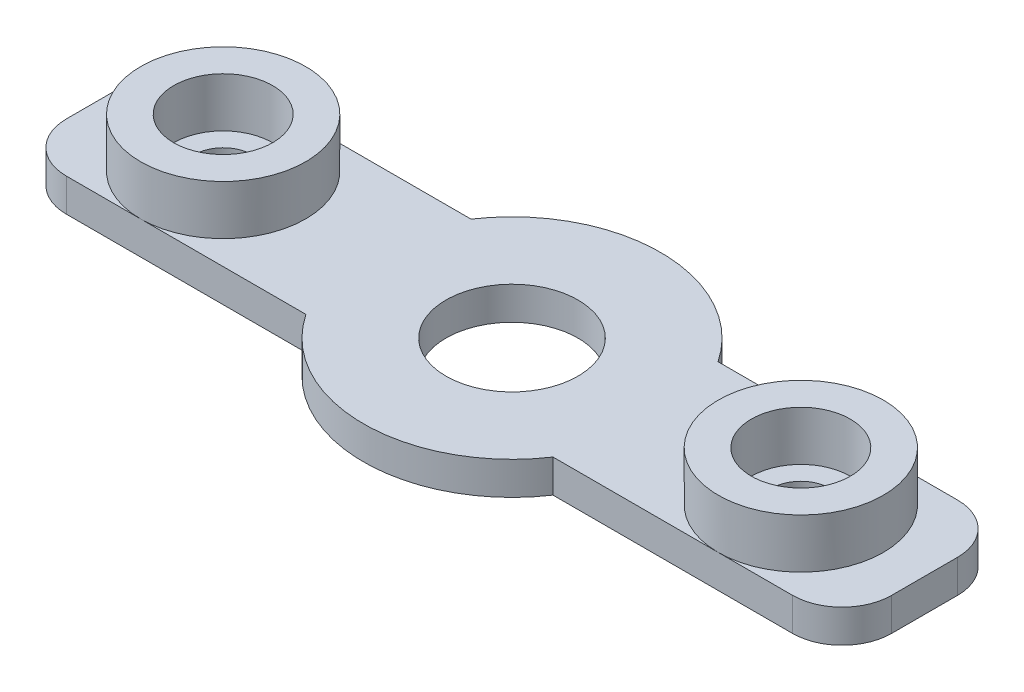
ISO-10303-21;
HEADER;
FILE_DESCRIPTION(('STEP AP214'),'2;1');
FILE_NAME('part.step','',(''),(''),'','','');
FILE_SCHEMA(('AUTOMOTIVE_DESIGN { 1 0 10303 214 1 1 1 1 }'));
ENDSEC;
DATA;
#1=APPLICATION_CONTEXT('core data for automotive mechanical design processes');
#2=APPLICATION_PROTOCOL_DEFINITION('international standard','automotive_design',2000,#1);
#3=PRODUCT_CONTEXT('',#1,'mechanical');
#4=PRODUCT('Part','Part','',(#3));
#5=PRODUCT_RELATED_PRODUCT_CATEGORY('part','',(#4));
#6=PRODUCT_DEFINITION_FORMATION('','',#4);
#7=PRODUCT_DEFINITION_CONTEXT('part definition',#1,'design');
#8=PRODUCT_DEFINITION('design','',#6,#7);
#9=PRODUCT_DEFINITION_SHAPE('','',#8);
#10=(LENGTH_UNIT() NAMED_UNIT(*) SI_UNIT(.MILLI.,.METRE.));
#11=(NAMED_UNIT(*) PLANE_ANGLE_UNIT() SI_UNIT($,.RADIAN.));
#12=(NAMED_UNIT(*) SI_UNIT($,.STERADIAN.) SOLID_ANGLE_UNIT());
#13=UNCERTAINTY_MEASURE_WITH_UNIT(LENGTH_MEASURE(1.E-05),#10,'distance_accuracy_value','');
#14=(GEOMETRIC_REPRESENTATION_CONTEXT(3) GLOBAL_UNCERTAINTY_ASSIGNED_CONTEXT((#13)) GLOBAL_UNIT_ASSIGNED_CONTEXT((#10,
#11,#12)) REPRESENTATION_CONTEXT('',''));
#15=CARTESIAN_POINT('',(0.,0.,0.));
#16=DIRECTION('',(0.,0.,1.));
#17=DIRECTION('',(1.,0.,0.));
#18=AXIS2_PLACEMENT_3D('',#15,#16,#17);
#19=CARTESIAN_POINT('',(0.,2.,0.));
#20=DIRECTION('',(0.,1.,0.));
#21=DIRECTION('',(0.,0.,1.));
#22=AXIS2_PLACEMENT_3D('',#19,#20,#21);
#23=PLANE('',#22);
#24=CARTESIAN_POINT('',(0.,2.,0.));
#25=DIRECTION('',(0.,1.,0.));
#26=DIRECTION('',(0.,0.,1.));
#27=AXIS2_PLACEMENT_3D('',#24,#25,#26);
#28=CIRCLE('',#27,4.);
#29=CARTESIAN_POINT('',(0.,2.,4.));
#30=VERTEX_POINT('',#29);
#31=EDGE_CURVE('E177',#30,#30,#28,.T.);
#32=ORIENTED_EDGE('',*,*,#31,.F.);
#33=EDGE_LOOP('',(#32));
#34=FACE_BOUND('',#33,.T.);
#35=DIRECTION('',(1.,0.,0.));
#36=VECTOR('',#35,1.);
#37=CARTESIAN_POINT('',(0.,2.,5.));
#38=LINE('',#37,#36);
#39=CARTESIAN_POINT('',(7.48331477354788,2.,5.));
#40=VERTEX_POINT('',#39);
#41=CARTESIAN_POINT('',(17.5,2.,5.));
#42=VERTEX_POINT('',#41);
#43=EDGE_CURVE('E145',#40,#42,#38,.T.);
#44=ORIENTED_EDGE('',*,*,#43,.T.);
#45=CARTESIAN_POINT('',(17.5,2.,0.));
#46=DIRECTION('',(0.,1.,0.));
#47=DIRECTION('',(0.,0.,-1.));
#48=AXIS2_PLACEMENT_3D('',#45,#46,#47);
#49=CIRCLE('',#48,5.);
#50=CARTESIAN_POINT('',(17.5,2.,-5.));
#51=VERTEX_POINT('',#50);
#52=EDGE_CURVE('E47',#51,#42,#49,.T.);
#53=ORIENTED_EDGE('',*,*,#52,.F.);
#54=DIRECTION('',(1.,0.,0.));
#55=VECTOR('',#54,1.);
#56=CARTESIAN_POINT('',(0.,2.,-5.));
#57=LINE('',#56,#55);
#58=CARTESIAN_POINT('',(7.48331477354788,2.,-5.));
#59=VERTEX_POINT('',#58);
#60=EDGE_CURVE('E143',#59,#51,#57,.T.);
#61=ORIENTED_EDGE('',*,*,#60,.F.);
#62=CARTESIAN_POINT('',(0.,2.,0.));
#63=DIRECTION('',(0.,1.,0.));
#64=DIRECTION('',(0.,0.,1.));
#65=AXIS2_PLACEMENT_3D('',#62,#63,#64);
#66=CIRCLE('',#65,9.);
#67=CARTESIAN_POINT('',(-7.48331477354788,2.,-5.));
#68=VERTEX_POINT('',#67);
#69=EDGE_CURVE('E162',#59,#68,#66,.T.);
#70=ORIENTED_EDGE('',*,*,#69,.T.);
#71=DIRECTION('',(1.,0.,0.));
#72=VECTOR('',#71,1.);
#73=CARTESIAN_POINT('',(0.,2.,-5.));
#74=LINE('',#73,#72);
#75=CARTESIAN_POINT('',(-17.5,2.,-5.));
#76=VERTEX_POINT('',#75);
#77=EDGE_CURVE('E163',#76,#68,#74,.T.);
#78=ORIENTED_EDGE('',*,*,#77,.F.);
#79=CARTESIAN_POINT('',(-17.5,2.,0.));
#80=DIRECTION('',(0.,1.,0.));
#81=DIRECTION('',(0.,0.,1.));
#82=AXIS2_PLACEMENT_3D('',#79,#80,#81);
#83=CIRCLE('',#82,5.);
#84=CARTESIAN_POINT('',(-17.5,2.,5.));
#85=VERTEX_POINT('',#84);
#86=EDGE_CURVE('E263',#85,#76,#83,.T.);
#87=ORIENTED_EDGE('',*,*,#86,.F.);
#88=DIRECTION('',(1.,0.,0.));
#89=VECTOR('',#88,1.);
#90=CARTESIAN_POINT('',(0.,2.,5.));
#91=LINE('',#90,#89);
#92=CARTESIAN_POINT('',(-7.48331477354788,2.,5.));
#93=VERTEX_POINT('',#92);
#94=EDGE_CURVE('E215',#85,#93,#91,.T.);
#95=ORIENTED_EDGE('',*,*,#94,.T.);
#96=CARTESIAN_POINT('',(0.,2.,0.));
#97=DIRECTION('',(0.,1.,0.));
#98=DIRECTION('',(0.,0.,1.));
#99=AXIS2_PLACEMENT_3D('',#96,#97,#98);
#100=CIRCLE('',#99,9.);
#101=EDGE_CURVE('E404',#93,#40,#100,.T.);
#102=ORIENTED_EDGE('',*,*,#101,.T.);
#103=EDGE_LOOP('',(#44,#53,#61,#70,#78,#87,#95,#102));
#104=FACE_BOUND('',#103,.T.);
#105=ADVANCED_FACE('F33',(#34,#104),#23,.T.);
#106=CARTESIAN_POINT('',(22.,2.,-5.));
#107=VERTEX_POINT('',#106);
#108=EDGE_CURVE('E148',#51,#107,#57,.T.);
#109=ORIENTED_EDGE('',*,*,#108,.F.);
#110=EDGE_CURVE('E131',#42,#51,#49,.T.);
#111=ORIENTED_EDGE('',*,*,#110,.F.);
#112=CARTESIAN_POINT('',(22.,2.,5.));
#113=VERTEX_POINT('',#112);
#114=EDGE_CURVE('E401',#42,#113,#38,.T.);
#115=ORIENTED_EDGE('',*,*,#114,.T.);
#116=CARTESIAN_POINT('',(22.,2.,2.));
#117=DIRECTION('',(0.,1.,0.));
#118=DIRECTION('',(0.,0.,1.));
#119=AXIS2_PLACEMENT_3D('',#116,#117,#118);
#120=CIRCLE('',#119,3.);
#121=CARTESIAN_POINT('',(25.,2.,2.));
#122=VERTEX_POINT('',#121);
#123=EDGE_CURVE('E242',#113,#122,#120,.T.);
#124=ORIENTED_EDGE('',*,*,#123,.T.);
#125=DIRECTION('',(0.,0.,1.));
#126=VECTOR('',#125,1.);
#127=CARTESIAN_POINT('',(25.,2.,0.));
#128=LINE('',#127,#126);
#129=CARTESIAN_POINT('',(25.,2.,-2.));
#130=VERTEX_POINT('',#129);
#131=EDGE_CURVE('E156',#130,#122,#128,.T.);
#132=ORIENTED_EDGE('',*,*,#131,.F.);
#133=CARTESIAN_POINT('',(22.,2.,-2.));
#134=DIRECTION('',(0.,1.,0.));
#135=DIRECTION('',(0.,0.,1.));
#136=AXIS2_PLACEMENT_3D('',#133,#134,#135);
#137=CIRCLE('',#136,3.);
#138=EDGE_CURVE('E152',#130,#107,#137,.T.);
#139=ORIENTED_EDGE('',*,*,#138,.T.);
#140=EDGE_LOOP('',(#109,#111,#115,#124,#132,#139));
#141=FACE_BOUND('',#140,.T.);
#142=ADVANCED_FACE('F149',(#141),#23,.T.);
#143=CARTESIAN_POINT('',(17.5,2.,0.));
#144=DIRECTION('',(0.,1.,0.));
#145=DIRECTION('',(0.,0.,1.));
#146=AXIS2_PLACEMENT_3D('',#143,#144,#145);
#147=CIRCLE('',#146,3.);
#148=CARTESIAN_POINT('',(17.5,2.,3.00000000000001));
#149=VERTEX_POINT('',#148);
#150=EDGE_CURVE('E11',#149,#149,#147,.F.);
#151=ORIENTED_EDGE('',*,*,#150,.F.);
#152=EDGE_LOOP('',(#151));
#153=FACE_BOUND('',#152,.T.);
#154=CARTESIAN_POINT('',(17.5,2.,0.));
#155=DIRECTION('',(0.,1.,0.));
#156=DIRECTION('',(0.,0.,1.));
#157=AXIS2_PLACEMENT_3D('',#154,#155,#156);
#158=CIRCLE('',#157,1.75);
#159=CARTESIAN_POINT('',(17.5,2.,1.75));
#160=VERTEX_POINT('',#159);
#161=EDGE_CURVE('E180',#160,#160,#158,.F.);
#162=ORIENTED_EDGE('',*,*,#161,.T.);
#163=EDGE_LOOP('',(#162));
#164=FACE_BOUND('',#163,.T.);
#165=ADVANCED_FACE('F308',(#153,#164),#23,.T.);
#166=CARTESIAN_POINT('',(-17.5,2.,0.));
#167=DIRECTION('',(0.,1.,0.));
#168=DIRECTION('',(0.,0.,1.));
#169=AXIS2_PLACEMENT_3D('',#166,#167,#168);
#170=CIRCLE('',#169,1.75);
#171=CARTESIAN_POINT('',(-17.5,2.,1.75));
#172=VERTEX_POINT('',#171);
#173=EDGE_CURVE('E174',#172,#172,#170,.T.);
#174=ORIENTED_EDGE('',*,*,#173,.F.);
#175=EDGE_LOOP('',(#174));
#176=FACE_BOUND('',#175,.T.);
#177=CARTESIAN_POINT('',(-17.5,2.,0.));
#178=DIRECTION('',(0.,1.,0.));
#179=DIRECTION('',(0.,0.,1.));
#180=AXIS2_PLACEMENT_3D('',#177,#178,#179);
#181=CIRCLE('',#180,3.);
#182=CARTESIAN_POINT('',(-17.5,2.,3.));
#183=VERTEX_POINT('',#182);
#184=EDGE_CURVE('E272',#183,#183,#181,.T.);
#185=ORIENTED_EDGE('',*,*,#184,.T.);
#186=EDGE_LOOP('',(#185));
#187=FACE_BOUND('',#186,.T.);
#188=ADVANCED_FACE('F315',(#176,#187),#23,.T.);
#189=CARTESIAN_POINT('',(0.,2.,5.));
#190=DIRECTION('',(0.,0.,-1.));
#191=DIRECTION('',(-1.,0.,0.));
#192=AXIS2_PLACEMENT_3D('',#189,#190,#191);
#193=PLANE('',#192);
#194=CARTESIAN_POINT('',(-22.,2.,5.));
#195=VERTEX_POINT('',#194);
#196=EDGE_CURVE('E406',#195,#85,#91,.T.);
#197=ORIENTED_EDGE('',*,*,#196,.F.);
#198=DIRECTION('',(0.,-1.,0.));
#199=VECTOR('',#198,1.);
#200=CARTESIAN_POINT('',(-22.,2.,5.));
#201=LINE('',#200,#199);
#202=CARTESIAN_POINT('',(-22.,0.,5.));
#203=VERTEX_POINT('',#202);
#204=EDGE_CURVE('E256',#195,#203,#201,.T.);
#205=ORIENTED_EDGE('',*,*,#204,.T.);
#206=DIRECTION('',(1.,0.,0.));
#207=VECTOR('',#206,1.);
#208=CARTESIAN_POINT('',(0.,0.,5.));
#209=LINE('',#208,#207);
#210=CARTESIAN_POINT('',(-7.48331477354788,0.,5.));
#211=VERTEX_POINT('',#210);
#212=EDGE_CURVE('E184',#203,#211,#209,.T.);
#213=ORIENTED_EDGE('',*,*,#212,.T.);
#214=DIRECTION('',(0.,-1.,0.));
#215=VECTOR('',#214,1.);
#216=CARTESIAN_POINT('',(-7.48331477354788,2.,5.));
#217=LINE('',#216,#215);
#218=EDGE_CURVE('E222',#93,#211,#217,.T.);
#219=ORIENTED_EDGE('',*,*,#218,.F.);
#220=ORIENTED_EDGE('',*,*,#94,.F.);
#221=EDGE_LOOP('',(#197,#205,#213,#219,#220));
#222=FACE_BOUND('',#221,.T.);
#223=ADVANCED_FACE('F326',(#222),#193,.F.);
#224=CARTESIAN_POINT('',(0.,2.,0.));
#225=DIRECTION('',(0.,-1.,0.));
#226=DIRECTION('',(0.,0.,-1.));
#227=AXIS2_PLACEMENT_3D('',#224,#225,#226);
#228=CYLINDRICAL_SURFACE('',#227,9.);
#229=CARTESIAN_POINT('',(0.,0.,0.));
#230=DIRECTION('',(0.,1.,0.));
#231=DIRECTION('',(0.,0.,1.));
#232=AXIS2_PLACEMENT_3D('',#229,#230,#231);
#233=CIRCLE('',#232,9.);
#234=CARTESIAN_POINT('',(7.48331477354788,0.,5.));
#235=VERTEX_POINT('',#234);
#236=EDGE_CURVE('E186',#211,#235,#233,.T.);
#237=ORIENTED_EDGE('',*,*,#236,.T.);
#238=DIRECTION('',(0.,-1.,0.));
#239=VECTOR('',#238,1.);
#240=CARTESIAN_POINT('',(7.48331477354788,2.,5.));
#241=LINE('',#240,#239);
#242=EDGE_CURVE('E219',#40,#235,#241,.T.);
#243=ORIENTED_EDGE('',*,*,#242,.F.);
#244=ORIENTED_EDGE('',*,*,#101,.F.);
#245=ORIENTED_EDGE('',*,*,#218,.T.);
#246=EDGE_LOOP('',(#237,#243,#244,#245));
#247=FACE_BOUND('',#246,.T.);
#248=ADVANCED_FACE('F332',(#247),#228,.T.);
#249=CARTESIAN_POINT('',(0.,2.,5.));
#250=DIRECTION('',(0.,0.,-1.));
#251=DIRECTION('',(-1.,0.,0.));
#252=AXIS2_PLACEMENT_3D('',#249,#250,#251);
#253=PLANE('',#252);
#254=DIRECTION('',(1.,0.,0.));
#255=VECTOR('',#254,1.);
#256=CARTESIAN_POINT('',(0.,0.,5.));
#257=LINE('',#256,#255);
#258=CARTESIAN_POINT('',(22.,0.,5.));
#259=VERTEX_POINT('',#258);
#260=EDGE_CURVE('E189',#235,#259,#257,.T.);
#261=ORIENTED_EDGE('',*,*,#260,.T.);
#262=DIRECTION('',(0.,-1.,0.));
#263=VECTOR('',#262,1.);
#264=CARTESIAN_POINT('',(22.,2.,5.));
#265=LINE('',#264,#263);
#266=EDGE_CURVE('E254',#259,#113,#265,.F.);
#267=ORIENTED_EDGE('',*,*,#266,.T.);
#268=ORIENTED_EDGE('',*,*,#114,.F.);
#269=ORIENTED_EDGE('',*,*,#43,.F.);
#270=ORIENTED_EDGE('',*,*,#242,.T.);
#271=EDGE_LOOP('',(#261,#267,#268,#269,#270));
#272=FACE_BOUND('',#271,.T.);
#273=ADVANCED_FACE('F375',(#272),#253,.F.);
#274=CARTESIAN_POINT('',(25.,2.,0.));
#275=DIRECTION('',(1.,0.,0.));
#276=DIRECTION('',(0.,0.,-1.));
#277=AXIS2_PLACEMENT_3D('',#274,#275,#276);
#278=PLANE('',#277);
#279=DIRECTION('',(0.,0.,1.));
#280=VECTOR('',#279,1.);
#281=CARTESIAN_POINT('',(25.,0.,0.));
#282=LINE('',#281,#280);
#283=CARTESIAN_POINT('',(25.,0.,-2.));
#284=VERTEX_POINT('',#283);
#285=CARTESIAN_POINT('',(25.,0.,2.));
#286=VERTEX_POINT('',#285);
#287=EDGE_CURVE('E192',#284,#286,#282,.T.);
#288=ORIENTED_EDGE('',*,*,#287,.F.);
#289=DIRECTION('',(0.,-1.,0.));
#290=VECTOR('',#289,1.);
#291=CARTESIAN_POINT('',(25.,2.,-2.));
#292=LINE('',#291,#290);
#293=EDGE_CURVE('E252',#284,#130,#292,.F.);
#294=ORIENTED_EDGE('',*,*,#293,.T.);
#295=ORIENTED_EDGE('',*,*,#131,.T.);
#296=DIRECTION('',(0.,-1.,0.));
#297=VECTOR('',#296,1.);
#298=CARTESIAN_POINT('',(25.,0.,2.));
#299=LINE('',#298,#297);
#300=EDGE_CURVE('E249',#122,#286,#299,.T.);
#301=ORIENTED_EDGE('',*,*,#300,.T.);
#302=EDGE_LOOP('',(#288,#294,#295,#301));
#303=FACE_BOUND('',#302,.T.);
#304=ADVANCED_FACE('F372',(#303),#278,.T.);
#305=CARTESIAN_POINT('',(0.,2.,-5.));
#306=DIRECTION('',(0.,0.,-1.));
#307=DIRECTION('',(-1.,0.,0.));
#308=AXIS2_PLACEMENT_3D('',#305,#306,#307);
#309=PLANE('',#308);
#310=ORIENTED_EDGE('',*,*,#60,.T.);
#311=ORIENTED_EDGE('',*,*,#108,.T.);
#312=DIRECTION('',(0.,-1.,0.));
#313=VECTOR('',#312,1.);
#314=CARTESIAN_POINT('',(22.,2.,-5.));
#315=LINE('',#314,#313);
#316=CARTESIAN_POINT('',(22.,0.,-5.));
#317=VERTEX_POINT('',#316);
#318=EDGE_CURVE('E247',#107,#317,#315,.T.);
#319=ORIENTED_EDGE('',*,*,#318,.T.);
#320=DIRECTION('',(1.,0.,0.));
#321=VECTOR('',#320,1.);
#322=CARTESIAN_POINT('',(0.,0.,-5.));
#323=LINE('',#322,#321);
#324=CARTESIAN_POINT('',(7.48331477354788,0.,-5.));
#325=VERTEX_POINT('',#324);
#326=EDGE_CURVE('E195',#325,#317,#323,.T.);
#327=ORIENTED_EDGE('',*,*,#326,.F.);
#328=DIRECTION('',(0.,-1.,0.));
#329=VECTOR('',#328,1.);
#330=CARTESIAN_POINT('',(7.48331477354788,2.,-5.));
#331=LINE('',#330,#329);
#332=EDGE_CURVE('E160',#59,#325,#331,.T.);
#333=ORIENTED_EDGE('',*,*,#332,.F.);
#334=EDGE_LOOP('',(#310,#311,#319,#327,#333));
#335=FACE_BOUND('',#334,.T.);
#336=ADVANCED_FACE('F158',(#335),#309,.T.);
#337=CARTESIAN_POINT('',(0.,2.,0.));
#338=DIRECTION('',(0.,-1.,0.));
#339=DIRECTION('',(0.,0.,-1.));
#340=AXIS2_PLACEMENT_3D('',#337,#338,#339);
#341=CYLINDRICAL_SURFACE('',#340,9.);
#342=CARTESIAN_POINT('',(0.,0.,0.));
#343=DIRECTION('',(0.,1.,0.));
#344=DIRECTION('',(0.,0.,1.));
#345=AXIS2_PLACEMENT_3D('',#342,#343,#344);
#346=CIRCLE('',#345,9.);
#347=CARTESIAN_POINT('',(-7.48331477354788,0.,-5.));
#348=VERTEX_POINT('',#347);
#349=EDGE_CURVE('E198',#325,#348,#346,.T.);
#350=ORIENTED_EDGE('',*,*,#349,.T.);
#351=DIRECTION('',(0.,-1.,0.));
#352=VECTOR('',#351,1.);
#353=CARTESIAN_POINT('',(-7.48331477354788,2.,-5.));
#354=LINE('',#353,#352);
#355=EDGE_CURVE('E183',#68,#348,#354,.T.);
#356=ORIENTED_EDGE('',*,*,#355,.F.);
#357=ORIENTED_EDGE('',*,*,#69,.F.);
#358=ORIENTED_EDGE('',*,*,#332,.T.);
#359=EDGE_LOOP('',(#350,#356,#357,#358));
#360=FACE_BOUND('',#359,.T.);
#361=ADVANCED_FACE('F360',(#360),#341,.T.);
#362=CARTESIAN_POINT('',(0.,2.,-5.));
#363=DIRECTION('',(0.,0.,-1.));
#364=DIRECTION('',(-1.,0.,0.));
#365=AXIS2_PLACEMENT_3D('',#362,#363,#364);
#366=PLANE('',#365);
#367=DIRECTION('',(1.,0.,0.));
#368=VECTOR('',#367,1.);
#369=CARTESIAN_POINT('',(0.,0.,-5.));
#370=LINE('',#369,#368);
#371=CARTESIAN_POINT('',(-22.,0.,-5.));
#372=VERTEX_POINT('',#371);
#373=EDGE_CURVE('E201',#372,#348,#370,.T.);
#374=ORIENTED_EDGE('',*,*,#373,.F.);
#375=DIRECTION('',(0.,-1.,0.));
#376=VECTOR('',#375,1.);
#377=CARTESIAN_POINT('',(-22.,2.,-5.));
#378=LINE('',#377,#376);
#379=CARTESIAN_POINT('',(-22.,2.,-5.));
#380=VERTEX_POINT('',#379);
#381=EDGE_CURVE('E238',#372,#380,#378,.F.);
#382=ORIENTED_EDGE('',*,*,#381,.T.);
#383=EDGE_CURVE('E168',#380,#76,#74,.T.);
#384=ORIENTED_EDGE('',*,*,#383,.T.);
#385=ORIENTED_EDGE('',*,*,#77,.T.);
#386=ORIENTED_EDGE('',*,*,#355,.T.);
#387=EDGE_LOOP('',(#374,#382,#384,#385,#386));
#388=FACE_BOUND('',#387,.T.);
#389=ADVANCED_FACE('F354',(#388),#366,.T.);
#390=CARTESIAN_POINT('',(0.,2.,0.));
#391=DIRECTION('',(0.,-1.,0.));
#392=DIRECTION('',(0.,0.,-1.));
#393=AXIS2_PLACEMENT_3D('',#390,#391,#392);
#394=CYLINDRICAL_SURFACE('',#393,4.);
#395=ORIENTED_EDGE('',*,*,#31,.T.);
#396=EDGE_LOOP('',(#395));
#397=FACE_BOUND('',#396,.T.);
#398=CARTESIAN_POINT('',(0.,0.,0.));
#399=DIRECTION('',(0.,1.,0.));
#400=DIRECTION('',(0.,0.,1.));
#401=AXIS2_PLACEMENT_3D('',#398,#399,#400);
#402=CIRCLE('',#401,4.);
#403=CARTESIAN_POINT('',(0.,0.,4.));
#404=VERTEX_POINT('',#403);
#405=EDGE_CURVE('E209',#404,#404,#402,.T.);
#406=ORIENTED_EDGE('',*,*,#405,.F.);
#407=EDGE_LOOP('',(#406));
#408=FACE_BOUND('',#407,.T.);
#409=ADVANCED_FACE('F343',(#397,#408),#394,.F.);
#410=CARTESIAN_POINT('',(-17.5,2.,0.));
#411=DIRECTION('',(0.,-1.,0.));
#412=DIRECTION('',(0.,0.,-1.));
#413=AXIS2_PLACEMENT_3D('',#410,#411,#412);
#414=CYLINDRICAL_SURFACE('',#413,1.75);
#415=ORIENTED_EDGE('',*,*,#173,.T.);
#416=EDGE_LOOP('',(#415));
#417=FACE_BOUND('',#416,.T.);
#418=CARTESIAN_POINT('',(-17.5,0.,0.));
#419=DIRECTION('',(0.,1.,0.));
#420=DIRECTION('',(0.,0.,1.));
#421=AXIS2_PLACEMENT_3D('',#418,#419,#420);
#422=CIRCLE('',#421,1.75);
#423=CARTESIAN_POINT('',(-17.5,0.,1.75));
#424=VERTEX_POINT('',#423);
#425=EDGE_CURVE('E206',#424,#424,#422,.T.);
#426=ORIENTED_EDGE('',*,*,#425,.F.);
#427=EDGE_LOOP('',(#426));
#428=FACE_BOUND('',#427,.T.);
#429=ADVANCED_FACE('F340',(#417,#428),#414,.F.);
#430=CARTESIAN_POINT('',(-25.,2.,0.));
#431=DIRECTION('',(1.,0.,0.));
#432=DIRECTION('',(0.,0.,-1.));
#433=AXIS2_PLACEMENT_3D('',#430,#431,#432);
#434=PLANE('',#433);
#435=DIRECTION('',(0.,0.,1.));
#436=VECTOR('',#435,1.);
#437=CARTESIAN_POINT('',(-25.,2.,0.));
#438=LINE('',#437,#436);
#439=CARTESIAN_POINT('',(-25.,2.,-2.));
#440=VERTEX_POINT('',#439);
#441=CARTESIAN_POINT('',(-25.,2.,2.));
#442=VERTEX_POINT('',#441);
#443=EDGE_CURVE('E171',#440,#442,#438,.T.);
#444=ORIENTED_EDGE('',*,*,#443,.F.);
#445=DIRECTION('',(0.,-1.,0.));
#446=VECTOR('',#445,1.);
#447=CARTESIAN_POINT('',(-25.,0.,-2.));
#448=LINE('',#447,#446);
#449=CARTESIAN_POINT('',(-25.,0.,-2.));
#450=VERTEX_POINT('',#449);
#451=EDGE_CURVE('E227',#440,#450,#448,.T.);
#452=ORIENTED_EDGE('',*,*,#451,.T.);
#453=DIRECTION('',(0.,0.,1.));
#454=VECTOR('',#453,1.);
#455=CARTESIAN_POINT('',(-25.,0.,0.));
#456=LINE('',#455,#454);
#457=CARTESIAN_POINT('',(-25.,0.,2.));
#458=VERTEX_POINT('',#457);
#459=EDGE_CURVE('E203',#450,#458,#456,.T.);
#460=ORIENTED_EDGE('',*,*,#459,.T.);
#461=DIRECTION('',(0.,-1.,0.));
#462=VECTOR('',#461,1.);
#463=CARTESIAN_POINT('',(-25.,2.,2.));
#464=LINE('',#463,#462);
#465=EDGE_CURVE('E225',#458,#442,#464,.F.);
#466=ORIENTED_EDGE('',*,*,#465,.T.);
#467=EDGE_LOOP('',(#444,#452,#460,#466));
#468=FACE_BOUND('',#467,.T.);
#469=ADVANCED_FACE('F322',(#468),#434,.F.);
#470=CARTESIAN_POINT('',(17.5,2.,0.));
#471=DIRECTION('',(0.,-1.,0.));
#472=DIRECTION('',(0.,0.,-1.));
#473=AXIS2_PLACEMENT_3D('',#470,#471,#472);
#474=CYLINDRICAL_SURFACE('',#473,1.75);
#475=ORIENTED_EDGE('',*,*,#161,.F.);
#476=EDGE_LOOP('',(#475));
#477=FACE_BOUND('',#476,.T.);
#478=CARTESIAN_POINT('',(17.5,0.,0.));
#479=DIRECTION('',(0.,1.,0.));
#480=DIRECTION('',(0.,0.,1.));
#481=AXIS2_PLACEMENT_3D('',#478,#479,#480);
#482=CIRCLE('',#481,1.75);
#483=CARTESIAN_POINT('',(17.5,0.,1.75));
#484=VERTEX_POINT('',#483);
#485=EDGE_CURVE('E212',#484,#484,#482,.F.);
#486=ORIENTED_EDGE('',*,*,#485,.T.);
#487=EDGE_LOOP('',(#486));
#488=FACE_BOUND('',#487,.T.);
#489=ADVANCED_FACE('F314',(#477,#488),#474,.F.);
#490=EDGE_CURVE('E41',#76,#85,#83,.T.);
#491=ORIENTED_EDGE('',*,*,#490,.F.);
#492=ORIENTED_EDGE('',*,*,#383,.F.);
#493=CARTESIAN_POINT('',(-22.,2.,-2.));
#494=DIRECTION('',(0.,1.,0.));
#495=DIRECTION('',(0.,0.,1.));
#496=AXIS2_PLACEMENT_3D('',#493,#494,#495);
#497=CIRCLE('',#496,3.);
#498=EDGE_CURVE('E245',#380,#440,#497,.T.);
#499=ORIENTED_EDGE('',*,*,#498,.T.);
#500=ORIENTED_EDGE('',*,*,#443,.T.);
#501=CARTESIAN_POINT('',(-22.,2.,2.));
#502=DIRECTION('',(0.,1.,0.));
#503=DIRECTION('',(0.,0.,1.));
#504=AXIS2_PLACEMENT_3D('',#501,#502,#503);
#505=CIRCLE('',#504,3.);
#506=EDGE_CURVE('E240',#442,#195,#505,.T.);
#507=ORIENTED_EDGE('',*,*,#506,.T.);
#508=ORIENTED_EDGE('',*,*,#196,.T.);
#509=EDGE_LOOP('',(#491,#492,#499,#500,#507,#508));
#510=FACE_BOUND('',#509,.T.);
#511=ADVANCED_FACE('F304',(#510),#23,.T.);
#512=CARTESIAN_POINT('',(0.,0.,0.));
#513=DIRECTION('',(0.,1.,0.));
#514=DIRECTION('',(0.,0.,1.));
#515=AXIS2_PLACEMENT_3D('',#512,#513,#514);
#516=PLANE('',#515);
#517=ORIENTED_EDGE('',*,*,#459,.F.);
#518=CARTESIAN_POINT('',(-22.,0.,-2.));
#519=DIRECTION('',(0.,1.,0.));
#520=DIRECTION('',(0.,0.,1.));
#521=AXIS2_PLACEMENT_3D('',#518,#519,#520);
#522=CIRCLE('',#521,3.);
#523=EDGE_CURVE('E236',#450,#372,#522,.F.);
#524=ORIENTED_EDGE('',*,*,#523,.T.);
#525=ORIENTED_EDGE('',*,*,#373,.T.);
#526=ORIENTED_EDGE('',*,*,#349,.F.);
#527=ORIENTED_EDGE('',*,*,#326,.T.);
#528=CARTESIAN_POINT('',(22.,0.,-2.));
#529=DIRECTION('',(0.,1.,0.));
#530=DIRECTION('',(0.,0.,1.));
#531=AXIS2_PLACEMENT_3D('',#528,#529,#530);
#532=CIRCLE('',#531,3.);
#533=EDGE_CURVE('E234',#317,#284,#532,.F.);
#534=ORIENTED_EDGE('',*,*,#533,.T.);
#535=ORIENTED_EDGE('',*,*,#287,.T.);
#536=CARTESIAN_POINT('',(22.,0.,2.));
#537=DIRECTION('',(0.,1.,0.));
#538=DIRECTION('',(0.,0.,1.));
#539=AXIS2_PLACEMENT_3D('',#536,#537,#538);
#540=CIRCLE('',#539,3.);
#541=EDGE_CURVE('E232',#286,#259,#540,.F.);
#542=ORIENTED_EDGE('',*,*,#541,.T.);
#543=ORIENTED_EDGE('',*,*,#260,.F.);
#544=ORIENTED_EDGE('',*,*,#236,.F.);
#545=ORIENTED_EDGE('',*,*,#212,.F.);
#546=CARTESIAN_POINT('',(-22.,0.,2.));
#547=DIRECTION('',(0.,1.,0.));
#548=DIRECTION('',(0.,0.,1.));
#549=AXIS2_PLACEMENT_3D('',#546,#547,#548);
#550=CIRCLE('',#549,3.);
#551=EDGE_CURVE('E230',#203,#458,#550,.F.);
#552=ORIENTED_EDGE('',*,*,#551,.T.);
#553=EDGE_LOOP('',(#517,#524,#525,#526,#527,#534,#535,#542,#543,#544,#545,#552));
#554=FACE_BOUND('',#553,.T.);
#555=ORIENTED_EDGE('',*,*,#425,.T.);
#556=EDGE_LOOP('',(#555));
#557=FACE_BOUND('',#556,.T.);
#558=ORIENTED_EDGE('',*,*,#405,.T.);
#559=EDGE_LOOP('',(#558));
#560=FACE_BOUND('',#559,.T.);
#561=ORIENTED_EDGE('',*,*,#485,.F.);
#562=EDGE_LOOP('',(#561));
#563=FACE_BOUND('',#562,.T.);
#564=ADVANCED_FACE('F313',(#554,#557,#560,#563),#516,.F.);
#565=CARTESIAN_POINT('',(-22.,2.,-2.));
#566=DIRECTION('',(0.,1.,0.));
#567=DIRECTION('',(0.,0.,1.));
#568=AXIS2_PLACEMENT_3D('',#565,#566,#567);
#569=CYLINDRICAL_SURFACE('',#568,3.);
#570=ORIENTED_EDGE('',*,*,#498,.F.);
#571=ORIENTED_EDGE('',*,*,#381,.F.);
#572=ORIENTED_EDGE('',*,*,#523,.F.);
#573=ORIENTED_EDGE('',*,*,#451,.F.);
#574=EDGE_LOOP('',(#570,#571,#572,#573));
#575=FACE_BOUND('',#574,.T.);
#576=ADVANCED_FACE('F320',(#575),#569,.T.);
#577=CARTESIAN_POINT('',(22.,2.,-2.));
#578=DIRECTION('',(0.,-1.,0.));
#579=DIRECTION('',(0.,0.,-1.));
#580=AXIS2_PLACEMENT_3D('',#577,#578,#579);
#581=CYLINDRICAL_SURFACE('',#580,3.);
#582=ORIENTED_EDGE('',*,*,#138,.F.);
#583=ORIENTED_EDGE('',*,*,#293,.F.);
#584=ORIENTED_EDGE('',*,*,#533,.F.);
#585=ORIENTED_EDGE('',*,*,#318,.F.);
#586=EDGE_LOOP('',(#582,#583,#584,#585));
#587=FACE_BOUND('',#586,.T.);
#588=ADVANCED_FACE('F385',(#587),#581,.T.);
#589=CARTESIAN_POINT('',(22.,2.,2.));
#590=DIRECTION('',(0.,1.,0.));
#591=DIRECTION('',(0.,0.,1.));
#592=AXIS2_PLACEMENT_3D('',#589,#590,#591);
#593=CYLINDRICAL_SURFACE('',#592,3.);
#594=ORIENTED_EDGE('',*,*,#123,.F.);
#595=ORIENTED_EDGE('',*,*,#266,.F.);
#596=ORIENTED_EDGE('',*,*,#541,.F.);
#597=ORIENTED_EDGE('',*,*,#300,.F.);
#598=EDGE_LOOP('',(#594,#595,#596,#597));
#599=FACE_BOUND('',#598,.T.);
#600=ADVANCED_FACE('F388',(#599),#593,.T.);
#601=CARTESIAN_POINT('',(-22.,2.,2.));
#602=DIRECTION('',(0.,-1.,0.));
#603=DIRECTION('',(0.,0.,-1.));
#604=AXIS2_PLACEMENT_3D('',#601,#602,#603);
#605=CYLINDRICAL_SURFACE('',#604,3.);
#606=ORIENTED_EDGE('',*,*,#506,.F.);
#607=ORIENTED_EDGE('',*,*,#465,.F.);
#608=ORIENTED_EDGE('',*,*,#551,.F.);
#609=ORIENTED_EDGE('',*,*,#204,.F.);
#610=EDGE_LOOP('',(#606,#607,#608,#609));
#611=FACE_BOUND('',#610,.T.);
#612=ADVANCED_FACE('F35',(#611),#605,.T.);
#613=CARTESIAN_POINT('',(-17.5,5.,0.));
#614=DIRECTION('',(0.,1.,0.));
#615=DIRECTION('',(0.,0.,1.));
#616=AXIS2_PLACEMENT_3D('',#613,#614,#615);
#617=PLANE('',#616);
#618=CARTESIAN_POINT('',(-17.5,5.,0.));
#619=DIRECTION('',(0.,1.,0.));
#620=DIRECTION('',(0.,0.,1.));
#621=AXIS2_PLACEMENT_3D('',#618,#619,#620);
#622=CIRCLE('',#621,5.);
#623=CARTESIAN_POINT('',(-17.5,5.,5.));
#624=VERTEX_POINT('',#623);
#625=EDGE_CURVE('E187',#624,#624,#622,.T.);
#626=ORIENTED_EDGE('',*,*,#625,.T.);
#627=EDGE_LOOP('',(#626));
#628=FACE_BOUND('',#627,.T.);
#629=CARTESIAN_POINT('',(-17.5,5.,0.));
#630=DIRECTION('',(0.,1.,0.));
#631=DIRECTION('',(0.,0.,1.));
#632=AXIS2_PLACEMENT_3D('',#629,#630,#631);
#633=CIRCLE('',#632,3.);
#634=CARTESIAN_POINT('',(-17.5,5.,3.));
#635=VERTEX_POINT('',#634);
#636=EDGE_CURVE('E268',#635,#635,#633,.T.);
#637=ORIENTED_EDGE('',*,*,#636,.F.);
#638=EDGE_LOOP('',(#637));
#639=FACE_BOUND('',#638,.T.);
#640=ADVANCED_FACE('F395',(#628,#639),#617,.T.);
#641=CARTESIAN_POINT('',(-17.5,5.,0.));
#642=DIRECTION('',(0.,-1.,0.));
#643=DIRECTION('',(0.,0.,-1.));
#644=AXIS2_PLACEMENT_3D('',#641,#642,#643);
#645=CYLINDRICAL_SURFACE('',#644,5.);
#646=ORIENTED_EDGE('',*,*,#625,.F.);
#647=EDGE_LOOP('',(#646));
#648=FACE_BOUND('',#647,.T.);
#649=ORIENTED_EDGE('',*,*,#86,.T.);
#650=ORIENTED_EDGE('',*,*,#490,.T.);
#651=EDGE_LOOP('',(#649,#650));
#652=FACE_BOUND('',#651,.T.);
#653=ADVANCED_FACE('F298',(#648,#652),#645,.T.);
#654=CARTESIAN_POINT('',(-17.5,5.,0.));
#655=DIRECTION('',(0.,-1.,0.));
#656=DIRECTION('',(0.,0.,-1.));
#657=AXIS2_PLACEMENT_3D('',#654,#655,#656);
#658=CYLINDRICAL_SURFACE('',#657,3.);
#659=ORIENTED_EDGE('',*,*,#636,.T.);
#660=EDGE_LOOP('',(#659));
#661=FACE_BOUND('',#660,.T.);
#662=ORIENTED_EDGE('',*,*,#184,.F.);
#663=EDGE_LOOP('',(#662));
#664=FACE_BOUND('',#663,.T.);
#665=ADVANCED_FACE('F289',(#661,#664),#658,.F.);
#666=CARTESIAN_POINT('',(17.5,5.,0.));
#667=DIRECTION('',(0.,-1.,0.));
#668=DIRECTION('',(0.,0.,-1.));
#669=AXIS2_PLACEMENT_3D('',#666,#667,#668);
#670=PLANE('',#669);
#671=CARTESIAN_POINT('',(17.5,5.,0.));
#672=DIRECTION('',(0.,1.,0.));
#673=DIRECTION('',(0.,0.,-1.));
#674=AXIS2_PLACEMENT_3D('',#671,#672,#673);
#675=CIRCLE('',#674,5.);
#676=CARTESIAN_POINT('',(17.5,5.,-5.));
#677=VERTEX_POINT('',#676);
#678=EDGE_CURVE('E146',#677,#677,#675,.T.);
#679=ORIENTED_EDGE('',*,*,#678,.T.);
#680=EDGE_LOOP('',(#679));
#681=FACE_BOUND('',#680,.T.);
#682=CARTESIAN_POINT('',(17.5,5.,0.));
#683=DIRECTION('',(0.,1.,0.));
#684=DIRECTION('',(0.,0.,-1.));
#685=AXIS2_PLACEMENT_3D('',#682,#683,#684);
#686=CIRCLE('',#685,3.);
#687=CARTESIAN_POINT('',(17.5,5.,-3.));
#688=VERTEX_POINT('',#687);
#689=EDGE_CURVE('E136',#688,#688,#686,.T.);
#690=ORIENTED_EDGE('',*,*,#689,.F.);
#691=EDGE_LOOP('',(#690));
#692=FACE_BOUND('',#691,.T.);
#693=ADVANCED_FACE('F287',(#681,#692),#670,.F.);
#694=CARTESIAN_POINT('',(17.5,5.,0.));
#695=DIRECTION('',(0.,-1.,0.));
#696=DIRECTION('',(0.,0.,-1.));
#697=AXIS2_PLACEMENT_3D('',#694,#695,#696);
#698=CYLINDRICAL_SURFACE('',#697,5.);
#699=ORIENTED_EDGE('',*,*,#678,.F.);
#700=EDGE_LOOP('',(#699));
#701=FACE_BOUND('',#700,.T.);
#702=ORIENTED_EDGE('',*,*,#52,.T.);
#703=ORIENTED_EDGE('',*,*,#110,.T.);
#704=EDGE_LOOP('',(#702,#703));
#705=FACE_BOUND('',#704,.T.);
#706=ADVANCED_FACE('F132',(#701,#705),#698,.T.);
#707=CARTESIAN_POINT('',(17.5,5.,0.));
#708=DIRECTION('',(0.,-1.,0.));
#709=DIRECTION('',(0.,0.,-1.));
#710=AXIS2_PLACEMENT_3D('',#707,#708,#709);
#711=CYLINDRICAL_SURFACE('',#710,3.);
#712=ORIENTED_EDGE('',*,*,#689,.T.);
#713=EDGE_LOOP('',(#712));
#714=FACE_BOUND('',#713,.T.);
#715=ORIENTED_EDGE('',*,*,#150,.T.);
#716=EDGE_LOOP('',(#715));
#717=FACE_BOUND('',#716,.T.);
#718=ADVANCED_FACE('F284',(#714,#717),#711,.F.);
#719=CLOSED_SHELL('',(#105,#142,#165,#188,#223,#248,#273,#304,#336,#361,#389,#409,#429,#469,
#489,#511,#564,#576,#588,#600,#612,#640,#653,#665,#693,#706,#718));
#720=MANIFOLD_SOLID_BREP('B2',#719);
#721=ADVANCED_BREP_SHAPE_REPRESENTATION('',(#18,#720),#14);
#722=SHAPE_DEFINITION_REPRESENTATION(#9,#721);
ENDSEC;
END-ISO-10303-21;
